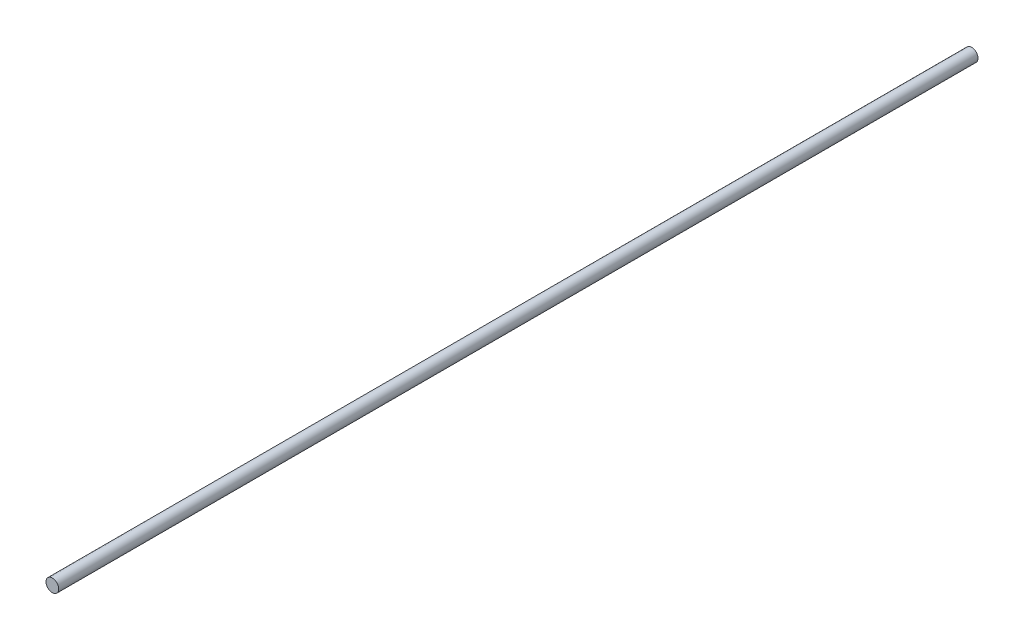
ISO-10303-21;
HEADER;
FILE_DESCRIPTION(('STEP AP214'),'2;1');
FILE_NAME('part.step','',(''),(''),'','','');
FILE_SCHEMA(('AUTOMOTIVE_DESIGN { 1 0 10303 214 1 1 1 1 }'));
ENDSEC;
DATA;
#1=APPLICATION_CONTEXT('core data for automotive mechanical design processes');
#2=APPLICATION_PROTOCOL_DEFINITION('international standard','automotive_design',2000,#1);
#3=PRODUCT_CONTEXT('',#1,'mechanical');
#4=PRODUCT('Part','Part','',(#3));
#5=PRODUCT_RELATED_PRODUCT_CATEGORY('part','',(#4));
#6=PRODUCT_DEFINITION_FORMATION('','',#4);
#7=PRODUCT_DEFINITION_CONTEXT('part definition',#1,'design');
#8=PRODUCT_DEFINITION('design','',#6,#7);
#9=PRODUCT_DEFINITION_SHAPE('','',#8);
#10=(LENGTH_UNIT() NAMED_UNIT(*) SI_UNIT(.MILLI.,.METRE.));
#11=(NAMED_UNIT(*) PLANE_ANGLE_UNIT() SI_UNIT($,.RADIAN.));
#12=(NAMED_UNIT(*) SI_UNIT($,.STERADIAN.) SOLID_ANGLE_UNIT());
#13=UNCERTAINTY_MEASURE_WITH_UNIT(LENGTH_MEASURE(1.E-05),#10,'distance_accuracy_value','');
#14=(GEOMETRIC_REPRESENTATION_CONTEXT(3) GLOBAL_UNCERTAINTY_ASSIGNED_CONTEXT((#13)) GLOBAL_UNIT_ASSIGNED_CONTEXT((#10,
#11,#12)) REPRESENTATION_CONTEXT('',''));
#15=CARTESIAN_POINT('',(0.,0.,0.));
#16=DIRECTION('',(0.,0.,1.));
#17=DIRECTION('',(1.,0.,0.));
#18=AXIS2_PLACEMENT_3D('',#15,#16,#17);
#19=CARTESIAN_POINT('',(0.,0.,304.5));
#20=DIRECTION('',(0.,0.,-1.));
#21=DIRECTION('',(-1.,0.,0.));
#22=AXIS2_PLACEMENT_3D('',#19,#20,#21);
#23=CYLINDRICAL_SURFACE('',#22,2.105);
#24=CARTESIAN_POINT('',(0.,0.,304.5));
#25=DIRECTION('',(0.,0.,1.));
#26=DIRECTION('',(1.,0.,0.));
#27=AXIS2_PLACEMENT_3D('',#24,#25,#26);
#28=CIRCLE('',#27,2.105);
#29=CARTESIAN_POINT('',(2.105,0.,304.5));
#30=VERTEX_POINT('',#29);
#31=EDGE_CURVE('E10',#30,#30,#28,.T.);
#32=ORIENTED_EDGE('',*,*,#31,.F.);
#33=EDGE_LOOP('',(#32));
#34=FACE_BOUND('',#33,.T.);
#35=CARTESIAN_POINT('',(0.,0.,0.));
#36=DIRECTION('',(0.,0.,1.));
#37=DIRECTION('',(1.,0.,0.));
#38=AXIS2_PLACEMENT_3D('',#35,#36,#37);
#39=CIRCLE('',#38,2.105);
#40=CARTESIAN_POINT('',(2.105,0.,0.));
#41=VERTEX_POINT('',#40);
#42=EDGE_CURVE('E34',#41,#41,#39,.T.);
#43=ORIENTED_EDGE('',*,*,#42,.T.);
#44=EDGE_LOOP('',(#43));
#45=FACE_BOUND('',#44,.T.);
#46=ADVANCED_FACE('F31',(#34,#45),#23,.T.);
#47=CARTESIAN_POINT('',(0.,0.,304.5));
#48=DIRECTION('',(0.,0.,1.));
#49=DIRECTION('',(1.,0.,0.));
#50=AXIS2_PLACEMENT_3D('',#47,#48,#49);
#51=PLANE('',#50);
#52=ORIENTED_EDGE('',*,*,#31,.T.);
#53=EDGE_LOOP('',(#52));
#54=FACE_BOUND('',#53,.T.);
#55=ADVANCED_FACE('F46',(#54),#51,.T.);
#56=CARTESIAN_POINT('',(0.,0.,0.));
#57=DIRECTION('',(0.,0.,1.));
#58=DIRECTION('',(1.,0.,0.));
#59=AXIS2_PLACEMENT_3D('',#56,#57,#58);
#60=PLANE('',#59);
#61=ORIENTED_EDGE('',*,*,#42,.F.);
#62=EDGE_LOOP('',(#61));
#63=FACE_BOUND('',#62,.T.);
#64=ADVANCED_FACE('F44',(#63),#60,.F.);
#65=CLOSED_SHELL('',(#46,#55,#64));
#66=MANIFOLD_SOLID_BREP('B2',#65);
#67=ADVANCED_BREP_SHAPE_REPRESENTATION('',(#18,#66),#14);
#68=SHAPE_DEFINITION_REPRESENTATION(#9,#67);
ENDSEC;
END-ISO-10303-21;
